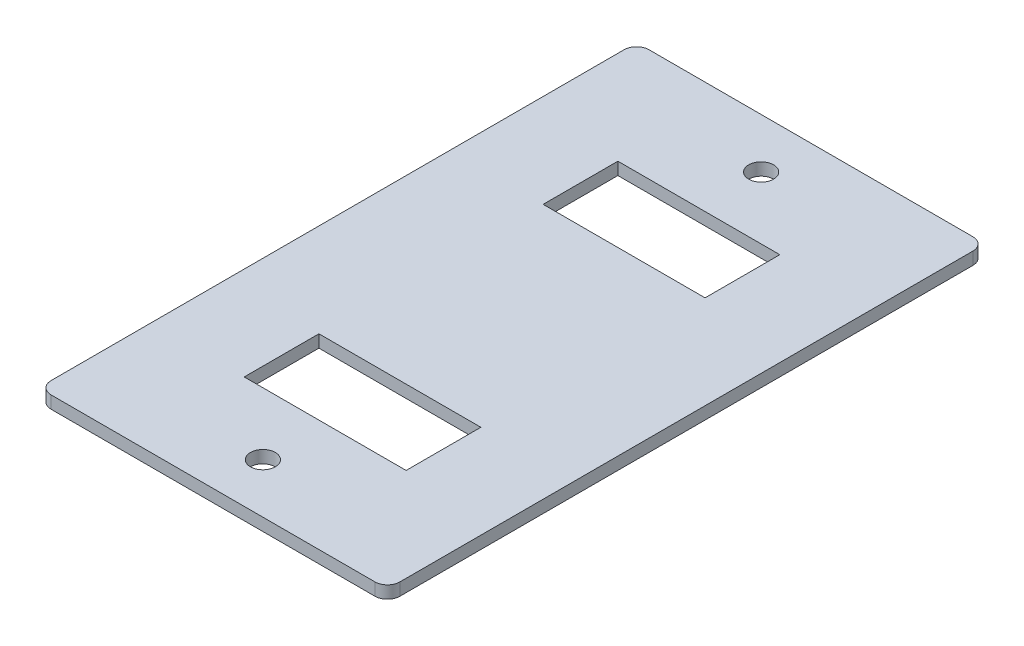
ISO-10303-21;
HEADER;
FILE_DESCRIPTION(('STEP AP214'),'2;1');
FILE_NAME('part.step','',(''),(''),'','','');
FILE_SCHEMA(('AUTOMOTIVE_DESIGN { 1 0 10303 214 1 1 1 1 }'));
ENDSEC;
DATA;
#1=APPLICATION_CONTEXT('core data for automotive mechanical design processes');
#2=APPLICATION_PROTOCOL_DEFINITION('international standard','automotive_design',2000,#1);
#3=PRODUCT_CONTEXT('',#1,'mechanical');
#4=PRODUCT('Part','Part','',(#3));
#5=PRODUCT_RELATED_PRODUCT_CATEGORY('part','',(#4));
#6=PRODUCT_DEFINITION_FORMATION('','',#4);
#7=PRODUCT_DEFINITION_CONTEXT('part definition',#1,'design');
#8=PRODUCT_DEFINITION('design','',#6,#7);
#9=PRODUCT_DEFINITION_SHAPE('','',#8);
#10=(LENGTH_UNIT() NAMED_UNIT(*) SI_UNIT(.MILLI.,.METRE.));
#11=(NAMED_UNIT(*) PLANE_ANGLE_UNIT() SI_UNIT($,.RADIAN.));
#12=(NAMED_UNIT(*) SI_UNIT($,.STERADIAN.) SOLID_ANGLE_UNIT());
#13=UNCERTAINTY_MEASURE_WITH_UNIT(LENGTH_MEASURE(1.E-05),#10,'distance_accuracy_value','');
#14=(GEOMETRIC_REPRESENTATION_CONTEXT(3) GLOBAL_UNCERTAINTY_ASSIGNED_CONTEXT((#13)) GLOBAL_UNIT_ASSIGNED_CONTEXT((#10,
#11,#12)) REPRESENTATION_CONTEXT('',''));
#15=CARTESIAN_POINT('',(0.,0.,0.));
#16=DIRECTION('',(0.,0.,1.));
#17=DIRECTION('',(1.,0.,0.));
#18=AXIS2_PLACEMENT_3D('',#15,#16,#17);
#19=CARTESIAN_POINT('',(35.,2.5,-60.));
#20=DIRECTION('',(-1.,0.,0.));
#21=DIRECTION('',(0.,0.,1.));
#22=AXIS2_PLACEMENT_3D('',#19,#20,#21);
#23=PLANE('',#22);
#24=DIRECTION('',(0.,0.,-1.));
#25=VECTOR('',#24,1.);
#26=CARTESIAN_POINT('',(35.,0.,-60.));
#27=LINE('',#26,#25);
#28=CARTESIAN_POINT('',(35.,0.,57.5));
#29=VERTEX_POINT('',#28);
#30=CARTESIAN_POINT('',(35.,0.,-57.5));
#31=VERTEX_POINT('',#30);
#32=EDGE_CURVE('E190',#29,#31,#27,.T.);
#33=ORIENTED_EDGE('',*,*,#32,.T.);
#34=DIRECTION('',(0.,-1.,0.));
#35=VECTOR('',#34,1.);
#36=CARTESIAN_POINT('',(35.,2.5,-57.5));
#37=LINE('',#36,#35);
#38=CARTESIAN_POINT('',(35.,2.5,-57.5));
#39=VERTEX_POINT('',#38);
#40=EDGE_CURVE('E11',#31,#39,#37,.F.);
#41=ORIENTED_EDGE('',*,*,#40,.T.);
#42=DIRECTION('',(0.,0.,-1.));
#43=VECTOR('',#42,1.);
#44=CARTESIAN_POINT('',(35.,2.5,-60.));
#45=LINE('',#44,#43);
#46=CARTESIAN_POINT('',(35.,2.5,57.5));
#47=VERTEX_POINT('',#46);
#48=EDGE_CURVE('E225',#47,#39,#45,.T.);
#49=ORIENTED_EDGE('',*,*,#48,.F.);
#50=DIRECTION('',(0.,-1.,0.));
#51=VECTOR('',#50,1.);
#52=CARTESIAN_POINT('',(35.,2.5,57.5));
#53=LINE('',#52,#51);
#54=EDGE_CURVE('E47',#47,#29,#53,.T.);
#55=ORIENTED_EDGE('',*,*,#54,.T.);
#56=EDGE_LOOP('',(#33,#41,#49,#55));
#57=FACE_BOUND('',#56,.T.);
#58=ADVANCED_FACE('F39',(#57),#23,.F.);
#59=CARTESIAN_POINT('',(-35.,2.5,-60.));
#60=DIRECTION('',(0.,0.,1.));
#61=DIRECTION('',(1.,0.,0.));
#62=AXIS2_PLACEMENT_3D('',#59,#60,#61);
#63=PLANE('',#62);
#64=DIRECTION('',(-1.,0.,0.));
#65=VECTOR('',#64,1.);
#66=CARTESIAN_POINT('',(-35.,0.,-60.));
#67=LINE('',#66,#65);
#68=CARTESIAN_POINT('',(32.5,0.,-60.));
#69=VERTEX_POINT('',#68);
#70=CARTESIAN_POINT('',(-32.5,0.,-60.));
#71=VERTEX_POINT('',#70);
#72=EDGE_CURVE('E241',#69,#71,#67,.T.);
#73=ORIENTED_EDGE('',*,*,#72,.T.);
#74=DIRECTION('',(0.,-1.,0.));
#75=VECTOR('',#74,1.);
#76=CARTESIAN_POINT('',(-32.5,2.5,-60.));
#77=LINE('',#76,#75);
#78=CARTESIAN_POINT('',(-32.5,2.5,-60.));
#79=VERTEX_POINT('',#78);
#80=EDGE_CURVE('E264',#71,#79,#77,.F.);
#81=ORIENTED_EDGE('',*,*,#80,.T.);
#82=DIRECTION('',(-1.,0.,0.));
#83=VECTOR('',#82,1.);
#84=CARTESIAN_POINT('',(-35.,2.5,-60.));
#85=LINE('',#84,#83);
#86=CARTESIAN_POINT('',(32.5,2.5,-60.));
#87=VERTEX_POINT('',#86);
#88=EDGE_CURVE('E228',#87,#79,#85,.T.);
#89=ORIENTED_EDGE('',*,*,#88,.F.);
#90=DIRECTION('',(0.,-1.,0.));
#91=VECTOR('',#90,1.);
#92=CARTESIAN_POINT('',(32.5,2.5,-60.));
#93=LINE('',#92,#91);
#94=EDGE_CURVE('E261',#87,#69,#93,.T.);
#95=ORIENTED_EDGE('',*,*,#94,.T.);
#96=EDGE_LOOP('',(#73,#81,#89,#95));
#97=FACE_BOUND('',#96,.T.);
#98=ADVANCED_FACE('F296',(#97),#63,.F.);
#99=CARTESIAN_POINT('',(-35.,2.5,-60.));
#100=DIRECTION('',(1.,0.,0.));
#101=DIRECTION('',(0.,0.,-1.));
#102=AXIS2_PLACEMENT_3D('',#99,#100,#101);
#103=PLANE('',#102);
#104=DIRECTION('',(0.,0.,1.));
#105=VECTOR('',#104,1.);
#106=CARTESIAN_POINT('',(-35.,2.5,-60.));
#107=LINE('',#106,#105);
#108=CARTESIAN_POINT('',(-35.,2.5,-57.5));
#109=VERTEX_POINT('',#108);
#110=CARTESIAN_POINT('',(-35.,2.5,57.5));
#111=VERTEX_POINT('',#110);
#112=EDGE_CURVE('E232',#109,#111,#107,.T.);
#113=ORIENTED_EDGE('',*,*,#112,.F.);
#114=DIRECTION('',(0.,-1.,0.));
#115=VECTOR('',#114,1.);
#116=CARTESIAN_POINT('',(-35.,2.5,-57.5));
#117=LINE('',#116,#115);
#118=CARTESIAN_POINT('',(-35.,0.,-57.5));
#119=VERTEX_POINT('',#118);
#120=EDGE_CURVE('E250',#109,#119,#117,.T.);
#121=ORIENTED_EDGE('',*,*,#120,.T.);
#122=DIRECTION('',(0.,0.,1.));
#123=VECTOR('',#122,1.);
#124=CARTESIAN_POINT('',(-35.,0.,-60.));
#125=LINE('',#124,#123);
#126=CARTESIAN_POINT('',(-35.,0.,57.5));
#127=VERTEX_POINT('',#126);
#128=EDGE_CURVE('E244',#119,#127,#125,.T.);
#129=ORIENTED_EDGE('',*,*,#128,.T.);
#130=DIRECTION('',(0.,-1.,0.));
#131=VECTOR('',#130,1.);
#132=CARTESIAN_POINT('',(-35.,2.5,57.5));
#133=LINE('',#132,#131);
#134=EDGE_CURVE('E238',#127,#111,#133,.F.);
#135=ORIENTED_EDGE('',*,*,#134,.T.);
#136=EDGE_LOOP('',(#113,#121,#129,#135));
#137=FACE_BOUND('',#136,.T.);
#138=ADVANCED_FACE('F306',(#137),#103,.F.);
#139=CARTESIAN_POINT('',(-35.,2.5,60.));
#140=DIRECTION('',(0.,0.,-1.));
#141=DIRECTION('',(-1.,0.,0.));
#142=AXIS2_PLACEMENT_3D('',#139,#140,#141);
#143=PLANE('',#142);
#144=DIRECTION('',(1.,0.,0.));
#145=VECTOR('',#144,1.);
#146=CARTESIAN_POINT('',(-35.,2.5,60.));
#147=LINE('',#146,#145);
#148=CARTESIAN_POINT('',(-32.5,2.5,60.));
#149=VERTEX_POINT('',#148);
#150=CARTESIAN_POINT('',(32.5,2.5,60.));
#151=VERTEX_POINT('',#150);
#152=EDGE_CURVE('E235',#149,#151,#147,.T.);
#153=ORIENTED_EDGE('',*,*,#152,.F.);
#154=DIRECTION('',(0.,-1.,0.));
#155=VECTOR('',#154,1.);
#156=CARTESIAN_POINT('',(-32.5,2.5,60.));
#157=LINE('',#156,#155);
#158=CARTESIAN_POINT('',(-32.5,0.,60.));
#159=VERTEX_POINT('',#158);
#160=EDGE_CURVE('E276',#149,#159,#157,.T.);
#161=ORIENTED_EDGE('',*,*,#160,.T.);
#162=DIRECTION('',(1.,0.,0.));
#163=VECTOR('',#162,1.);
#164=CARTESIAN_POINT('',(-35.,0.,60.));
#165=LINE('',#164,#163);
#166=CARTESIAN_POINT('',(32.5,0.,60.));
#167=VERTEX_POINT('',#166);
#168=EDGE_CURVE('E229',#159,#167,#165,.T.);
#169=ORIENTED_EDGE('',*,*,#168,.T.);
#170=DIRECTION('',(0.,-1.,0.));
#171=VECTOR('',#170,1.);
#172=CARTESIAN_POINT('',(32.5,2.5,60.));
#173=LINE('',#172,#171);
#174=EDGE_CURVE('E274',#167,#151,#173,.F.);
#175=ORIENTED_EDGE('',*,*,#174,.T.);
#176=EDGE_LOOP('',(#153,#161,#169,#175));
#177=FACE_BOUND('',#176,.T.);
#178=ADVANCED_FACE('F314',(#177),#143,.F.);
#179=CARTESIAN_POINT('',(0.,2.5,0.));
#180=DIRECTION('',(0.,1.,0.));
#181=DIRECTION('',(0.,0.,1.));
#182=AXIS2_PLACEMENT_3D('',#179,#180,#181);
#183=PLANE('',#182);
#184=CARTESIAN_POINT('',(0.,2.5,-50.));
#185=DIRECTION('',(0.,1.,0.));
#186=DIRECTION('',(0.,0.,1.));
#187=AXIS2_PLACEMENT_3D('',#184,#185,#186);
#188=CIRCLE('',#187,2.5);
#189=CARTESIAN_POINT('',(0.,2.5,-47.5));
#190=VERTEX_POINT('',#189);
#191=EDGE_CURVE('E499',#190,#190,#188,.T.);
#192=ORIENTED_EDGE('',*,*,#191,.F.);
#193=EDGE_LOOP('',(#192));
#194=FACE_BOUND('',#193,.T.);
#195=CARTESIAN_POINT('',(0.,2.5,50.));
#196=DIRECTION('',(0.,1.,0.));
#197=DIRECTION('',(0.,0.,1.));
#198=AXIS2_PLACEMENT_3D('',#195,#196,#197);
#199=CIRCLE('',#198,2.5);
#200=CARTESIAN_POINT('',(0.,2.5,52.5));
#201=VERTEX_POINT('',#200);
#202=EDGE_CURVE('E497',#201,#201,#199,.T.);
#203=ORIENTED_EDGE('',*,*,#202,.F.);
#204=EDGE_LOOP('',(#203));
#205=FACE_BOUND('',#204,.T.);
#206=DIRECTION('',(0.,0.,-1.));
#207=VECTOR('',#206,1.);
#208=CARTESIAN_POINT('',(16.25,2.5,-37.5));
#209=LINE('',#208,#207);
#210=CARTESIAN_POINT('',(16.25,2.5,-22.5));
#211=VERTEX_POINT('',#210);
#212=CARTESIAN_POINT('',(16.25,2.5,-37.5));
#213=VERTEX_POINT('',#212);
#214=EDGE_CURVE('E54',#211,#213,#209,.T.);
#215=ORIENTED_EDGE('',*,*,#214,.F.);
#216=DIRECTION('',(1.,0.,0.));
#217=VECTOR('',#216,1.);
#218=CARTESIAN_POINT('',(-16.25,2.5,-22.5));
#219=LINE('',#218,#217);
#220=CARTESIAN_POINT('',(-16.25,2.5,-22.5));
#221=VERTEX_POINT('',#220);
#222=EDGE_CURVE('E172',#221,#211,#219,.T.);
#223=ORIENTED_EDGE('',*,*,#222,.F.);
#224=DIRECTION('',(0.,0.,1.));
#225=VECTOR('',#224,1.);
#226=CARTESIAN_POINT('',(-16.25,2.5,-37.5));
#227=LINE('',#226,#225);
#228=CARTESIAN_POINT('',(-16.25,2.5,-37.5));
#229=VERTEX_POINT('',#228);
#230=EDGE_CURVE('E175',#229,#221,#227,.T.);
#231=ORIENTED_EDGE('',*,*,#230,.F.);
#232=DIRECTION('',(-1.,0.,0.));
#233=VECTOR('',#232,1.);
#234=CARTESIAN_POINT('',(-16.25,2.5,-37.5));
#235=LINE('',#234,#233);
#236=EDGE_CURVE('E184',#213,#229,#235,.T.);
#237=ORIENTED_EDGE('',*,*,#236,.F.);
#238=EDGE_LOOP('',(#215,#223,#231,#237));
#239=FACE_BOUND('',#238,.T.);
#240=DIRECTION('',(0.,0.,-1.));
#241=VECTOR('',#240,1.);
#242=CARTESIAN_POINT('',(16.25,2.5,22.5));
#243=LINE('',#242,#241);
#244=CARTESIAN_POINT('',(16.25,2.5,37.5));
#245=VERTEX_POINT('',#244);
#246=CARTESIAN_POINT('',(16.25,2.5,22.5));
#247=VERTEX_POINT('',#246);
#248=EDGE_CURVE('E62',#245,#247,#243,.T.);
#249=ORIENTED_EDGE('',*,*,#248,.F.);
#250=DIRECTION('',(1.,0.,0.));
#251=VECTOR('',#250,1.);
#252=CARTESIAN_POINT('',(-16.25,2.5,37.5));
#253=LINE('',#252,#251);
#254=CARTESIAN_POINT('',(-16.25,2.5,37.5));
#255=VERTEX_POINT('',#254);
#256=EDGE_CURVE('E204',#255,#245,#253,.T.);
#257=ORIENTED_EDGE('',*,*,#256,.F.);
#258=DIRECTION('',(0.,0.,1.));
#259=VECTOR('',#258,1.);
#260=CARTESIAN_POINT('',(-16.25,2.5,22.5));
#261=LINE('',#260,#259);
#262=CARTESIAN_POINT('',(-16.25,2.5,22.5));
#263=VERTEX_POINT('',#262);
#264=EDGE_CURVE('E207',#263,#255,#261,.T.);
#265=ORIENTED_EDGE('',*,*,#264,.F.);
#266=DIRECTION('',(-1.,0.,0.));
#267=VECTOR('',#266,1.);
#268=CARTESIAN_POINT('',(-16.25,2.5,22.5));
#269=LINE('',#268,#267);
#270=EDGE_CURVE('E211',#247,#263,#269,.T.);
#271=ORIENTED_EDGE('',*,*,#270,.F.);
#272=EDGE_LOOP('',(#249,#257,#265,#271));
#273=FACE_BOUND('',#272,.T.);
#274=ORIENTED_EDGE('',*,*,#88,.T.);
#275=CARTESIAN_POINT('',(-32.5,2.5,-57.5));
#276=DIRECTION('',(0.,1.,0.));
#277=DIRECTION('',(0.,0.,1.));
#278=AXIS2_PLACEMENT_3D('',#275,#276,#277);
#279=CIRCLE('',#278,2.5);
#280=EDGE_CURVE('E272',#79,#109,#279,.T.);
#281=ORIENTED_EDGE('',*,*,#280,.T.);
#282=ORIENTED_EDGE('',*,*,#112,.T.);
#283=CARTESIAN_POINT('',(-32.5,2.5,57.5));
#284=DIRECTION('',(0.,1.,0.));
#285=DIRECTION('',(0.,0.,1.));
#286=AXIS2_PLACEMENT_3D('',#283,#284,#285);
#287=CIRCLE('',#286,2.5);
#288=EDGE_CURVE('E270',#111,#149,#287,.T.);
#289=ORIENTED_EDGE('',*,*,#288,.T.);
#290=ORIENTED_EDGE('',*,*,#152,.T.);
#291=CARTESIAN_POINT('',(32.5,2.5,57.5));
#292=DIRECTION('',(0.,1.,0.));
#293=DIRECTION('',(0.,0.,1.));
#294=AXIS2_PLACEMENT_3D('',#291,#292,#293);
#295=CIRCLE('',#294,2.5);
#296=EDGE_CURVE('E266',#151,#47,#295,.T.);
#297=ORIENTED_EDGE('',*,*,#296,.T.);
#298=ORIENTED_EDGE('',*,*,#48,.T.);
#299=CARTESIAN_POINT('',(32.5,2.5,-57.5));
#300=DIRECTION('',(0.,1.,0.));
#301=DIRECTION('',(0.,0.,1.));
#302=AXIS2_PLACEMENT_3D('',#299,#300,#301);
#303=CIRCLE('',#302,2.5);
#304=EDGE_CURVE('E268',#39,#87,#303,.T.);
#305=ORIENTED_EDGE('',*,*,#304,.T.);
#306=EDGE_LOOP('',(#274,#281,#282,#289,#290,#297,#298,#305));
#307=FACE_BOUND('',#306,.T.);
#308=ADVANCED_FACE('F300',(#194,#205,#239,#273,#307),#183,.T.);
#309=CARTESIAN_POINT('',(0.,0.,0.));
#310=DIRECTION('',(0.,1.,0.));
#311=DIRECTION('',(0.,0.,1.));
#312=AXIS2_PLACEMENT_3D('',#309,#310,#311);
#313=PLANE('',#312);
#314=CARTESIAN_POINT('',(0.,0.,-50.));
#315=DIRECTION('',(0.,1.,0.));
#316=DIRECTION('',(0.,0.,1.));
#317=AXIS2_PLACEMENT_3D('',#314,#315,#316);
#318=CIRCLE('',#317,2.5);
#319=CARTESIAN_POINT('',(0.,0.,-47.5));
#320=VERTEX_POINT('',#319);
#321=EDGE_CURVE('E203',#320,#320,#318,.T.);
#322=ORIENTED_EDGE('',*,*,#321,.T.);
#323=EDGE_LOOP('',(#322));
#324=FACE_BOUND('',#323,.T.);
#325=CARTESIAN_POINT('',(0.,0.,50.));
#326=DIRECTION('',(0.,1.,0.));
#327=DIRECTION('',(0.,0.,1.));
#328=AXIS2_PLACEMENT_3D('',#325,#326,#327);
#329=CIRCLE('',#328,2.5);
#330=CARTESIAN_POINT('',(0.,0.,52.5));
#331=VERTEX_POINT('',#330);
#332=EDGE_CURVE('E178',#331,#331,#329,.T.);
#333=ORIENTED_EDGE('',*,*,#332,.T.);
#334=EDGE_LOOP('',(#333));
#335=FACE_BOUND('',#334,.T.);
#336=DIRECTION('',(1.,0.,0.));
#337=VECTOR('',#336,1.);
#338=CARTESIAN_POINT('',(-16.25,0.,-22.5));
#339=LINE('',#338,#337);
#340=CARTESIAN_POINT('',(-16.25,0.,-22.5));
#341=VERTEX_POINT('',#340);
#342=CARTESIAN_POINT('',(16.25,0.,-22.5));
#343=VERTEX_POINT('',#342);
#344=EDGE_CURVE('E159',#341,#343,#339,.T.);
#345=ORIENTED_EDGE('',*,*,#344,.T.);
#346=DIRECTION('',(0.,0.,-1.));
#347=VECTOR('',#346,1.);
#348=CARTESIAN_POINT('',(16.25,0.,-37.5));
#349=LINE('',#348,#347);
#350=CARTESIAN_POINT('',(16.25,0.,-37.5));
#351=VERTEX_POINT('',#350);
#352=EDGE_CURVE('E153',#343,#351,#349,.T.);
#353=ORIENTED_EDGE('',*,*,#352,.T.);
#354=DIRECTION('',(-1.,0.,0.));
#355=VECTOR('',#354,1.);
#356=CARTESIAN_POINT('',(-16.25,0.,-37.5));
#357=LINE('',#356,#355);
#358=CARTESIAN_POINT('',(-16.25,0.,-37.5));
#359=VERTEX_POINT('',#358);
#360=EDGE_CURVE('E163',#351,#359,#357,.T.);
#361=ORIENTED_EDGE('',*,*,#360,.T.);
#362=DIRECTION('',(0.,0.,1.));
#363=VECTOR('',#362,1.);
#364=CARTESIAN_POINT('',(-16.25,0.,-37.5));
#365=LINE('',#364,#363);
#366=EDGE_CURVE('E167',#359,#341,#365,.T.);
#367=ORIENTED_EDGE('',*,*,#366,.T.);
#368=EDGE_LOOP('',(#345,#353,#361,#367));
#369=FACE_BOUND('',#368,.T.);
#370=DIRECTION('',(1.,0.,0.));
#371=VECTOR('',#370,1.);
#372=CARTESIAN_POINT('',(-16.25,0.,37.5));
#373=LINE('',#372,#371);
#374=CARTESIAN_POINT('',(-16.25,0.,37.5));
#375=VERTEX_POINT('',#374);
#376=CARTESIAN_POINT('',(16.25,0.,37.5));
#377=VERTEX_POINT('',#376);
#378=EDGE_CURVE('E196',#375,#377,#373,.T.);
#379=ORIENTED_EDGE('',*,*,#378,.T.);
#380=DIRECTION('',(0.,0.,-1.));
#381=VECTOR('',#380,1.);
#382=CARTESIAN_POINT('',(16.25,0.,22.5));
#383=LINE('',#382,#381);
#384=CARTESIAN_POINT('',(16.25,0.,22.5));
#385=VERTEX_POINT('',#384);
#386=EDGE_CURVE('E208',#377,#385,#383,.T.);
#387=ORIENTED_EDGE('',*,*,#386,.T.);
#388=DIRECTION('',(-1.,0.,0.));
#389=VECTOR('',#388,1.);
#390=CARTESIAN_POINT('',(-16.25,0.,22.5));
#391=LINE('',#390,#389);
#392=CARTESIAN_POINT('',(-16.25,0.,22.5));
#393=VERTEX_POINT('',#392);
#394=EDGE_CURVE('E220',#385,#393,#391,.T.);
#395=ORIENTED_EDGE('',*,*,#394,.T.);
#396=DIRECTION('',(0.,0.,1.));
#397=VECTOR('',#396,1.);
#398=CARTESIAN_POINT('',(-16.25,0.,22.5));
#399=LINE('',#398,#397);
#400=EDGE_CURVE('E217',#393,#375,#399,.T.);
#401=ORIENTED_EDGE('',*,*,#400,.T.);
#402=EDGE_LOOP('',(#379,#387,#395,#401));
#403=FACE_BOUND('',#402,.T.);
#404=ORIENTED_EDGE('',*,*,#128,.F.);
#405=CARTESIAN_POINT('',(-32.5,0.,-57.5));
#406=DIRECTION('',(0.,1.,0.));
#407=DIRECTION('',(0.,0.,1.));
#408=AXIS2_PLACEMENT_3D('',#405,#406,#407);
#409=CIRCLE('',#408,2.5);
#410=EDGE_CURVE('E259',#119,#71,#409,.F.);
#411=ORIENTED_EDGE('',*,*,#410,.T.);
#412=ORIENTED_EDGE('',*,*,#72,.F.);
#413=CARTESIAN_POINT('',(32.5,0.,-57.5));
#414=DIRECTION('',(0.,1.,0.));
#415=DIRECTION('',(0.,0.,1.));
#416=AXIS2_PLACEMENT_3D('',#413,#414,#415);
#417=CIRCLE('',#416,2.5);
#418=EDGE_CURVE('E255',#69,#31,#417,.F.);
#419=ORIENTED_EDGE('',*,*,#418,.T.);
#420=ORIENTED_EDGE('',*,*,#32,.F.);
#421=CARTESIAN_POINT('',(32.5,0.,57.5));
#422=DIRECTION('',(0.,1.,0.));
#423=DIRECTION('',(0.,0.,1.));
#424=AXIS2_PLACEMENT_3D('',#421,#422,#423);
#425=CIRCLE('',#424,2.5);
#426=EDGE_CURVE('E253',#29,#167,#425,.F.);
#427=ORIENTED_EDGE('',*,*,#426,.T.);
#428=ORIENTED_EDGE('',*,*,#168,.F.);
#429=CARTESIAN_POINT('',(-32.5,0.,57.5));
#430=DIRECTION('',(0.,1.,0.));
#431=DIRECTION('',(0.,0.,1.));
#432=AXIS2_PLACEMENT_3D('',#429,#430,#431);
#433=CIRCLE('',#432,2.5);
#434=EDGE_CURVE('E257',#159,#127,#433,.F.);
#435=ORIENTED_EDGE('',*,*,#434,.T.);
#436=EDGE_LOOP('',(#404,#411,#412,#419,#420,#427,#428,#435));
#437=FACE_BOUND('',#436,.T.);
#438=ADVANCED_FACE('F169',(#324,#335,#369,#403,#437),#313,.F.);
#439=CARTESIAN_POINT('',(-32.5,2.5,-57.5));
#440=DIRECTION('',(0.,-1.,0.));
#441=DIRECTION('',(0.,0.,-1.));
#442=AXIS2_PLACEMENT_3D('',#439,#440,#441);
#443=CYLINDRICAL_SURFACE('',#442,2.5);
#444=ORIENTED_EDGE('',*,*,#280,.F.);
#445=ORIENTED_EDGE('',*,*,#80,.F.);
#446=ORIENTED_EDGE('',*,*,#410,.F.);
#447=ORIENTED_EDGE('',*,*,#120,.F.);
#448=EDGE_LOOP('',(#444,#445,#446,#447));
#449=FACE_BOUND('',#448,.T.);
#450=ADVANCED_FACE('F304',(#449),#443,.T.);
#451=CARTESIAN_POINT('',(-32.5,2.5,57.5));
#452=DIRECTION('',(0.,-1.,0.));
#453=DIRECTION('',(0.,0.,-1.));
#454=AXIS2_PLACEMENT_3D('',#451,#452,#453);
#455=CYLINDRICAL_SURFACE('',#454,2.5);
#456=ORIENTED_EDGE('',*,*,#288,.F.);
#457=ORIENTED_EDGE('',*,*,#134,.F.);
#458=ORIENTED_EDGE('',*,*,#434,.F.);
#459=ORIENTED_EDGE('',*,*,#160,.F.);
#460=EDGE_LOOP('',(#456,#457,#458,#459));
#461=FACE_BOUND('',#460,.T.);
#462=ADVANCED_FACE('F311',(#461),#455,.T.);
#463=CARTESIAN_POINT('',(32.5,2.5,-57.5));
#464=DIRECTION('',(0.,-1.,0.));
#465=DIRECTION('',(0.,0.,-1.));
#466=AXIS2_PLACEMENT_3D('',#463,#464,#465);
#467=CYLINDRICAL_SURFACE('',#466,2.5);
#468=ORIENTED_EDGE('',*,*,#304,.F.);
#469=ORIENTED_EDGE('',*,*,#40,.F.);
#470=ORIENTED_EDGE('',*,*,#418,.F.);
#471=ORIENTED_EDGE('',*,*,#94,.F.);
#472=EDGE_LOOP('',(#468,#469,#470,#471));
#473=FACE_BOUND('',#472,.T.);
#474=ADVANCED_FACE('F293',(#473),#467,.T.);
#475=CARTESIAN_POINT('',(32.5,2.5,57.5));
#476=DIRECTION('',(0.,-1.,0.));
#477=DIRECTION('',(0.,0.,-1.));
#478=AXIS2_PLACEMENT_3D('',#475,#476,#477);
#479=CYLINDRICAL_SURFACE('',#478,2.5);
#480=ORIENTED_EDGE('',*,*,#296,.F.);
#481=ORIENTED_EDGE('',*,*,#174,.F.);
#482=ORIENTED_EDGE('',*,*,#426,.F.);
#483=ORIENTED_EDGE('',*,*,#54,.F.);
#484=EDGE_LOOP('',(#480,#481,#482,#483));
#485=FACE_BOUND('',#484,.T.);
#486=ADVANCED_FACE('F41',(#485),#479,.T.);
#487=CARTESIAN_POINT('',(16.25,0.,22.5));
#488=DIRECTION('',(1.,0.,0.));
#489=DIRECTION('',(0.,0.,-1.));
#490=AXIS2_PLACEMENT_3D('',#487,#488,#489);
#491=PLANE('',#490);
#492=ORIENTED_EDGE('',*,*,#248,.T.);
#493=DIRECTION('',(0.,1.,0.));
#494=VECTOR('',#493,1.);
#495=CARTESIAN_POINT('',(16.25,0.,22.5));
#496=LINE('',#495,#494);
#497=EDGE_CURVE('E194',#385,#247,#496,.T.);
#498=ORIENTED_EDGE('',*,*,#497,.F.);
#499=ORIENTED_EDGE('',*,*,#386,.F.);
#500=DIRECTION('',(0.,1.,0.));
#501=VECTOR('',#500,1.);
#502=CARTESIAN_POINT('',(16.25,0.,37.5));
#503=LINE('',#502,#501);
#504=EDGE_CURVE('E201',#377,#245,#503,.T.);
#505=ORIENTED_EDGE('',*,*,#504,.T.);
#506=EDGE_LOOP('',(#492,#498,#499,#505));
#507=FACE_BOUND('',#506,.T.);
#508=ADVANCED_FACE('F317',(#507),#491,.F.);
#509=CARTESIAN_POINT('',(-16.25,0.,37.5));
#510=DIRECTION('',(0.,0.,1.));
#511=DIRECTION('',(1.,0.,0.));
#512=AXIS2_PLACEMENT_3D('',#509,#510,#511);
#513=PLANE('',#512);
#514=ORIENTED_EDGE('',*,*,#256,.T.);
#515=ORIENTED_EDGE('',*,*,#504,.F.);
#516=ORIENTED_EDGE('',*,*,#378,.F.);
#517=DIRECTION('',(0.,1.,0.));
#518=VECTOR('',#517,1.);
#519=CARTESIAN_POINT('',(-16.25,0.,37.5));
#520=LINE('',#519,#518);
#521=EDGE_CURVE('E199',#375,#255,#520,.T.);
#522=ORIENTED_EDGE('',*,*,#521,.T.);
#523=EDGE_LOOP('',(#514,#515,#516,#522));
#524=FACE_BOUND('',#523,.T.);
#525=ADVANCED_FACE('F322',(#524),#513,.F.);
#526=CARTESIAN_POINT('',(-16.25,0.,22.5));
#527=DIRECTION('',(-1.,0.,0.));
#528=DIRECTION('',(0.,0.,1.));
#529=AXIS2_PLACEMENT_3D('',#526,#527,#528);
#530=PLANE('',#529);
#531=ORIENTED_EDGE('',*,*,#264,.T.);
#532=ORIENTED_EDGE('',*,*,#521,.F.);
#533=ORIENTED_EDGE('',*,*,#400,.F.);
#534=DIRECTION('',(0.,1.,0.));
#535=VECTOR('',#534,1.);
#536=CARTESIAN_POINT('',(-16.25,0.,22.5));
#537=LINE('',#536,#535);
#538=EDGE_CURVE('E197',#393,#263,#537,.T.);
#539=ORIENTED_EDGE('',*,*,#538,.T.);
#540=EDGE_LOOP('',(#531,#532,#533,#539));
#541=FACE_BOUND('',#540,.T.);
#542=ADVANCED_FACE('F365',(#541),#530,.F.);
#543=CARTESIAN_POINT('',(-16.25,0.,22.5));
#544=DIRECTION('',(0.,0.,-1.));
#545=DIRECTION('',(-1.,0.,0.));
#546=AXIS2_PLACEMENT_3D('',#543,#544,#545);
#547=PLANE('',#546);
#548=ORIENTED_EDGE('',*,*,#270,.T.);
#549=ORIENTED_EDGE('',*,*,#538,.F.);
#550=ORIENTED_EDGE('',*,*,#394,.F.);
#551=ORIENTED_EDGE('',*,*,#497,.T.);
#552=EDGE_LOOP('',(#548,#549,#550,#551));
#553=FACE_BOUND('',#552,.T.);
#554=ADVANCED_FACE('F375',(#553),#547,.F.);
#555=CARTESIAN_POINT('',(16.25,0.,-37.5));
#556=DIRECTION('',(1.,0.,0.));
#557=DIRECTION('',(0.,0.,-1.));
#558=AXIS2_PLACEMENT_3D('',#555,#556,#557);
#559=PLANE('',#558);
#560=ORIENTED_EDGE('',*,*,#214,.T.);
#561=DIRECTION('',(0.,1.,0.));
#562=VECTOR('',#561,1.);
#563=CARTESIAN_POINT('',(16.25,0.,-37.5));
#564=LINE('',#563,#562);
#565=EDGE_CURVE('E149',#351,#213,#564,.T.);
#566=ORIENTED_EDGE('',*,*,#565,.F.);
#567=ORIENTED_EDGE('',*,*,#352,.F.);
#568=DIRECTION('',(0.,1.,0.));
#569=VECTOR('',#568,1.);
#570=CARTESIAN_POINT('',(16.25,0.,-22.5));
#571=LINE('',#570,#569);
#572=EDGE_CURVE('E188',#343,#211,#571,.T.);
#573=ORIENTED_EDGE('',*,*,#572,.T.);
#574=EDGE_LOOP('',(#560,#566,#567,#573));
#575=FACE_BOUND('',#574,.T.);
#576=ADVANCED_FACE('F151',(#575),#559,.F.);
#577=CARTESIAN_POINT('',(-16.25,0.,-22.5));
#578=DIRECTION('',(0.,0.,1.));
#579=DIRECTION('',(1.,0.,0.));
#580=AXIS2_PLACEMENT_3D('',#577,#578,#579);
#581=PLANE('',#580);
#582=ORIENTED_EDGE('',*,*,#222,.T.);
#583=ORIENTED_EDGE('',*,*,#572,.F.);
#584=ORIENTED_EDGE('',*,*,#344,.F.);
#585=DIRECTION('',(0.,1.,0.));
#586=VECTOR('',#585,1.);
#587=CARTESIAN_POINT('',(-16.25,0.,-22.5));
#588=LINE('',#587,#586);
#589=EDGE_CURVE('E191',#341,#221,#588,.T.);
#590=ORIENTED_EDGE('',*,*,#589,.T.);
#591=EDGE_LOOP('',(#582,#583,#584,#590));
#592=FACE_BOUND('',#591,.T.);
#593=ADVANCED_FACE('F394',(#592),#581,.F.);
#594=CARTESIAN_POINT('',(-16.25,0.,-37.5));
#595=DIRECTION('',(-1.,0.,0.));
#596=DIRECTION('',(0.,0.,1.));
#597=AXIS2_PLACEMENT_3D('',#594,#595,#596);
#598=PLANE('',#597);
#599=ORIENTED_EDGE('',*,*,#230,.T.);
#600=ORIENTED_EDGE('',*,*,#589,.F.);
#601=ORIENTED_EDGE('',*,*,#366,.F.);
#602=DIRECTION('',(0.,1.,0.));
#603=VECTOR('',#602,1.);
#604=CARTESIAN_POINT('',(-16.25,0.,-37.5));
#605=LINE('',#604,#603);
#606=EDGE_CURVE('E158',#359,#229,#605,.T.);
#607=ORIENTED_EDGE('',*,*,#606,.T.);
#608=EDGE_LOOP('',(#599,#600,#601,#607));
#609=FACE_BOUND('',#608,.T.);
#610=ADVANCED_FACE('F403',(#609),#598,.F.);
#611=CARTESIAN_POINT('',(-16.25,0.,-37.5));
#612=DIRECTION('',(0.,0.,-1.));
#613=DIRECTION('',(-1.,0.,0.));
#614=AXIS2_PLACEMENT_3D('',#611,#612,#613);
#615=PLANE('',#614);
#616=ORIENTED_EDGE('',*,*,#236,.T.);
#617=ORIENTED_EDGE('',*,*,#606,.F.);
#618=ORIENTED_EDGE('',*,*,#360,.F.);
#619=ORIENTED_EDGE('',*,*,#565,.T.);
#620=EDGE_LOOP('',(#616,#617,#618,#619));
#621=FACE_BOUND('',#620,.T.);
#622=ADVANCED_FACE('F164',(#621),#615,.F.);
#623=CARTESIAN_POINT('',(0.,0.,50.));
#624=DIRECTION('',(0.,1.,0.));
#625=DIRECTION('',(0.,0.,1.));
#626=AXIS2_PLACEMENT_3D('',#623,#624,#625);
#627=CYLINDRICAL_SURFACE('',#626,2.5);
#628=ORIENTED_EDGE('',*,*,#332,.F.);
#629=EDGE_LOOP('',(#628));
#630=FACE_BOUND('',#629,.T.);
#631=ORIENTED_EDGE('',*,*,#202,.T.);
#632=EDGE_LOOP('',(#631));
#633=FACE_BOUND('',#632,.T.);
#634=ADVANCED_FACE('F422',(#630,#633),#627,.F.);
#635=CARTESIAN_POINT('',(0.,0.,-50.));
#636=DIRECTION('',(0.,1.,0.));
#637=DIRECTION('',(0.,0.,1.));
#638=AXIS2_PLACEMENT_3D('',#635,#636,#637);
#639=CYLINDRICAL_SURFACE('',#638,2.5);
#640=ORIENTED_EDGE('',*,*,#321,.F.);
#641=EDGE_LOOP('',(#640));
#642=FACE_BOUND('',#641,.T.);
#643=ORIENTED_EDGE('',*,*,#191,.T.);
#644=EDGE_LOOP('',(#643));
#645=FACE_BOUND('',#644,.T.);
#646=ADVANCED_FACE('F432',(#642,#645),#639,.F.);
#647=CLOSED_SHELL('',(#58,#98,#138,#178,#308,#438,#450,#462,#474,#486,#508,#525,#542,#554,#576,
#593,#610,#622,#634,#646));
#648=MANIFOLD_SOLID_BREP('B2',#647);
#649=ADVANCED_BREP_SHAPE_REPRESENTATION('',(#18,#648),#14);
#650=SHAPE_DEFINITION_REPRESENTATION(#9,#649);
ENDSEC;
END-ISO-10303-21;
